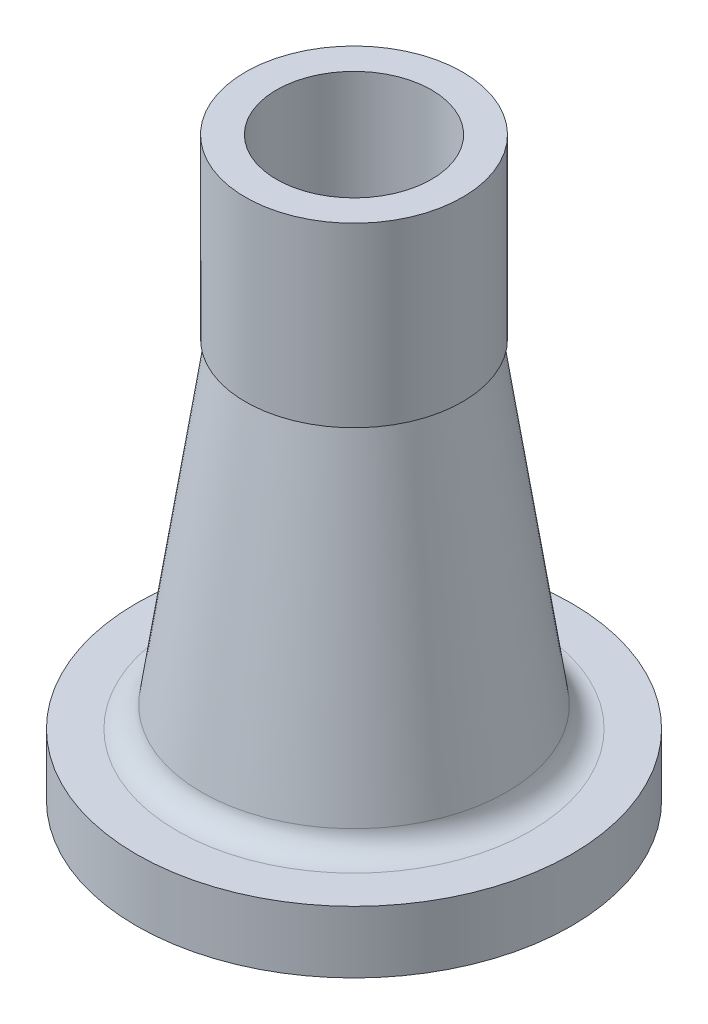
ISO-10303-21;
HEADER;
FILE_DESCRIPTION(('STEP AP214'),'2;1');
FILE_NAME('part.step','',(''),(''),'','','');
FILE_SCHEMA(('AUTOMOTIVE_DESIGN { 1 0 10303 214 1 1 1 1 }'));
ENDSEC;
DATA;
#1=APPLICATION_CONTEXT('core data for automotive mechanical design processes');
#2=APPLICATION_PROTOCOL_DEFINITION('international standard','automotive_design',2000,#1);
#3=PRODUCT_CONTEXT('',#1,'mechanical');
#4=PRODUCT('Part','Part','',(#3));
#5=PRODUCT_RELATED_PRODUCT_CATEGORY('part','',(#4));
#6=PRODUCT_DEFINITION_FORMATION('','',#4);
#7=PRODUCT_DEFINITION_CONTEXT('part definition',#1,'design');
#8=PRODUCT_DEFINITION('design','',#6,#7);
#9=PRODUCT_DEFINITION_SHAPE('','',#8);
#10=(LENGTH_UNIT() NAMED_UNIT(*) SI_UNIT(.MILLI.,.METRE.));
#11=(NAMED_UNIT(*) PLANE_ANGLE_UNIT() SI_UNIT($,.RADIAN.));
#12=(NAMED_UNIT(*) SI_UNIT($,.STERADIAN.) SOLID_ANGLE_UNIT());
#13=UNCERTAINTY_MEASURE_WITH_UNIT(LENGTH_MEASURE(1.E-05),#10,'distance_accuracy_value','');
#14=(GEOMETRIC_REPRESENTATION_CONTEXT(3) GLOBAL_UNCERTAINTY_ASSIGNED_CONTEXT((#13)) GLOBAL_UNIT_ASSIGNED_CONTEXT((#10,
#11,#12)) REPRESENTATION_CONTEXT('',''));
#15=CARTESIAN_POINT('',(0.,0.,0.));
#16=DIRECTION('',(0.,0.,1.));
#17=DIRECTION('',(1.,0.,0.));
#18=AXIS2_PLACEMENT_3D('',#15,#16,#17);
#19=CARTESIAN_POINT('',(35.,128.787624663047,0.));
#20=DIRECTION('',(0.,-1.,0.));
#21=DIRECTION('',(0.,0.,-1.));
#22=AXIS2_PLACEMENT_3D('',#19,#20,#21);
#23=PLANE('',#22);
#24=CARTESIAN_POINT('',(0.,128.787624663047,0.));
#25=DIRECTION('',(0.,-1.,0.));
#26=DIRECTION('',(0.,0.,-1.));
#27=AXIS2_PLACEMENT_3D('',#24,#25,#26);
#28=CIRCLE('',#27,35.);
#29=CARTESIAN_POINT('',(0.,128.787624663047,-35.));
#30=VERTEX_POINT('',#29);
#31=EDGE_CURVE('E80',#30,#30,#28,.T.);
#32=ORIENTED_EDGE('',*,*,#31,.T.);
#33=EDGE_LOOP('',(#32));
#34=FACE_BOUND('',#33,.T.);
#35=CARTESIAN_POINT('',(0.,128.787624663047,0.));
#36=DIRECTION('',(0.,-1.,0.));
#37=DIRECTION('',(0.,0.,-1.));
#38=AXIS2_PLACEMENT_3D('',#35,#36,#37);
#39=CIRCLE('',#38,33.9637624694383);
#40=CARTESIAN_POINT('',(0.,128.787624663047,-33.9637624694383));
#41=VERTEX_POINT('',#40);
#42=EDGE_CURVE('E48',#41,#41,#39,.T.);
#43=ORIENTED_EDGE('',*,*,#42,.F.);
#44=EDGE_LOOP('',(#43));
#45=FACE_BOUND('',#44,.T.);
#46=ADVANCED_FACE('F40',(#34,#45),#23,.T.);
#47=CARTESIAN_POINT('',(0.,20.,0.));
#48=DIRECTION('',(0.,-1.,0.));
#49=DIRECTION('',(0.,0.,-1.));
#50=AXIS2_PLACEMENT_3D('',#47,#48,#49);
#51=CONICAL_SURFACE('',#50,50.1245103142679,0.147474667585903);
#52=CARTESIAN_POINT('',(0.,26.8244745362526,0.));
#53=DIRECTION('',(0.,-1.,0.));
#54=DIRECTION('',(0.,0.,-1.));
#55=AXIS2_PLACEMENT_3D('',#52,#53,#54);
#56=CIRCLE('',#55,49.1107129039886);
#57=CARTESIAN_POINT('',(0.,26.8244745362526,-49.1107129039886));
#58=VERTEX_POINT('',#57);
#59=EDGE_CURVE('E10',#58,#58,#56,.F.);
#60=ORIENTED_EDGE('',*,*,#59,.T.);
#61=EDGE_LOOP('',(#60));
#62=FACE_BOUND('',#61,.T.);
#63=ORIENTED_EDGE('',*,*,#42,.T.);
#64=EDGE_LOOP('',(#63));
#65=FACE_BOUND('',#64,.T.);
#66=ADVANCED_FACE('F97',(#62,#65),#51,.T.);
#67=CARTESIAN_POINT('',(70.1245103142679,20.,0.));
#68=DIRECTION('',(0.,1.,0.));
#69=DIRECTION('',(0.,0.,1.));
#70=AXIS2_PLACEMENT_3D('',#67,#68,#69);
#71=PLANE('',#70);
#72=CARTESIAN_POINT('',(0.,20.,0.));
#73=DIRECTION('',(0.,1.,0.));
#74=DIRECTION('',(0.,0.,1.));
#75=AXIS2_PLACEMENT_3D('',#72,#73,#74);
#76=CIRCLE('',#75,57.0238753491859);
#77=CARTESIAN_POINT('',(0.,20.,57.0238753491859));
#78=VERTEX_POINT('',#77);
#79=EDGE_CURVE('E42',#78,#78,#76,.F.);
#80=ORIENTED_EDGE('',*,*,#79,.T.);
#81=EDGE_LOOP('',(#80));
#82=FACE_BOUND('',#81,.T.);
#83=CARTESIAN_POINT('',(0.,20.,0.));
#84=DIRECTION('',(0.,-1.,0.));
#85=DIRECTION('',(0.,0.,-1.));
#86=AXIS2_PLACEMENT_3D('',#83,#84,#85);
#87=CIRCLE('',#86,70.1245103142679);
#88=CARTESIAN_POINT('',(0.,20.,-70.1245103142679));
#89=VERTEX_POINT('',#88);
#90=EDGE_CURVE('E55',#89,#89,#87,.T.);
#91=ORIENTED_EDGE('',*,*,#90,.F.);
#92=EDGE_LOOP('',(#91));
#93=FACE_BOUND('',#92,.T.);
#94=ADVANCED_FACE('F103',(#82,#93),#71,.T.);
#95=CARTESIAN_POINT('',(0.,0.,0.));
#96=DIRECTION('',(0.,-1.,0.));
#97=DIRECTION('',(0.,0.,-1.));
#98=AXIS2_PLACEMENT_3D('',#95,#96,#97);
#99=CYLINDRICAL_SURFACE('',#98,70.1245103142679);
#100=ORIENTED_EDGE('',*,*,#90,.T.);
#101=EDGE_LOOP('',(#100));
#102=FACE_BOUND('',#101,.T.);
#103=CARTESIAN_POINT('',(0.,0.,0.));
#104=DIRECTION('',(0.,-1.,0.));
#105=DIRECTION('',(0.,0.,-1.));
#106=AXIS2_PLACEMENT_3D('',#103,#104,#105);
#107=CIRCLE('',#106,70.1245103142679);
#108=CARTESIAN_POINT('',(0.,0.,-70.1245103142679));
#109=VERTEX_POINT('',#108);
#110=EDGE_CURVE('E60',#109,#109,#107,.T.);
#111=ORIENTED_EDGE('',*,*,#110,.F.);
#112=EDGE_LOOP('',(#111));
#113=FACE_BOUND('',#112,.T.);
#114=ADVANCED_FACE('F107',(#102,#113),#99,.T.);
#115=CARTESIAN_POINT('',(50.,0.,0.));
#116=DIRECTION('',(0.,-1.,0.));
#117=DIRECTION('',(0.,0.,-1.));
#118=AXIS2_PLACEMENT_3D('',#115,#116,#117);
#119=PLANE('',#118);
#120=ORIENTED_EDGE('',*,*,#110,.T.);
#121=EDGE_LOOP('',(#120));
#122=FACE_BOUND('',#121,.T.);
#123=CARTESIAN_POINT('',(0.,0.,0.));
#124=DIRECTION('',(0.,-1.,0.));
#125=DIRECTION('',(0.,0.,-1.));
#126=AXIS2_PLACEMENT_3D('',#123,#124,#125);
#127=CIRCLE('',#126,50.);
#128=CARTESIAN_POINT('',(0.,0.,-50.));
#129=VERTEX_POINT('',#128);
#130=EDGE_CURVE('E58',#129,#129,#127,.T.);
#131=ORIENTED_EDGE('',*,*,#130,.F.);
#132=EDGE_LOOP('',(#131));
#133=FACE_BOUND('',#132,.T.);
#134=ADVANCED_FACE('F109',(#122,#133),#119,.T.);
#135=CARTESIAN_POINT('',(0.,0.,0.));
#136=DIRECTION('',(0.,-1.,0.));
#137=DIRECTION('',(0.,0.,-1.));
#138=AXIS2_PLACEMENT_3D('',#135,#136,#137);
#139=CYLINDRICAL_SURFACE('',#138,50.);
#140=ORIENTED_EDGE('',*,*,#130,.T.);
#141=EDGE_LOOP('',(#140));
#142=FACE_BOUND('',#141,.T.);
#143=CARTESIAN_POINT('',(0.,3.89945678039064,0.));
#144=DIRECTION('',(0.,-1.,0.));
#145=DIRECTION('',(0.,0.,-1.));
#146=AXIS2_PLACEMENT_3D('',#143,#144,#145);
#147=CIRCLE('',#146,50.);
#148=CARTESIAN_POINT('',(0.,3.89945678039064,-50.));
#149=VERTEX_POINT('',#148);
#150=EDGE_CURVE('E65',#149,#149,#147,.T.);
#151=ORIENTED_EDGE('',*,*,#150,.F.);
#152=EDGE_LOOP('',(#151));
#153=FACE_BOUND('',#152,.T.);
#154=ADVANCED_FACE('F111',(#142,#153),#139,.F.);
#155=CARTESIAN_POINT('',(42.406559130004,3.89945678039064,0.));
#156=DIRECTION('',(0.,-1.,0.));
#157=DIRECTION('',(0.,0.,-1.));
#158=AXIS2_PLACEMENT_3D('',#155,#156,#157);
#159=PLANE('',#158);
#160=ORIENTED_EDGE('',*,*,#150,.T.);
#161=EDGE_LOOP('',(#160));
#162=FACE_BOUND('',#161,.T.);
#163=CARTESIAN_POINT('',(0.,3.89945678039064,0.));
#164=DIRECTION('',(0.,-1.,0.));
#165=DIRECTION('',(0.,0.,-1.));
#166=AXIS2_PLACEMENT_3D('',#163,#164,#165);
#167=CIRCLE('',#166,42.406559130004);
#168=CARTESIAN_POINT('',(0.,3.89945678039064,-42.406559130004));
#169=VERTEX_POINT('',#168);
#170=EDGE_CURVE('E68',#169,#169,#167,.T.);
#171=ORIENTED_EDGE('',*,*,#170,.F.);
#172=EDGE_LOOP('',(#171));
#173=FACE_BOUND('',#172,.T.);
#174=ADVANCED_FACE('F120',(#162,#173),#159,.T.);
#175=CARTESIAN_POINT('',(0.,121.073379639156,0.));
#176=DIRECTION('',(0.,-1.,0.));
#177=DIRECTION('',(0.,0.,-1.));
#178=AXIS2_PLACEMENT_3D('',#175,#176,#177);
#179=CONICAL_SURFACE('',#178,25.,0.147474667585903);
#180=ORIENTED_EDGE('',*,*,#170,.T.);
#181=EDGE_LOOP('',(#180));
#182=FACE_BOUND('',#181,.T.);
#183=CARTESIAN_POINT('',(0.,121.073379639156,0.));
#184=DIRECTION('',(0.,-1.,0.));
#185=DIRECTION('',(0.,0.,-1.));
#186=AXIS2_PLACEMENT_3D('',#183,#184,#185);
#187=CIRCLE('',#186,25.);
#188=CARTESIAN_POINT('',(0.,121.073379639156,-25.));
#189=VERTEX_POINT('',#188);
#190=EDGE_CURVE('E69',#189,#189,#187,.T.);
#191=ORIENTED_EDGE('',*,*,#190,.F.);
#192=EDGE_LOOP('',(#191));
#193=FACE_BOUND('',#192,.T.);
#194=ADVANCED_FACE('F125',(#182,#193),#179,.F.);
#195=CARTESIAN_POINT('',(0.,0.,0.));
#196=DIRECTION('',(0.,-1.,0.));
#197=DIRECTION('',(0.,0.,-1.));
#198=AXIS2_PLACEMENT_3D('',#195,#196,#197);
#199=CYLINDRICAL_SURFACE('',#198,24.9999999999999);
#200=ORIENTED_EDGE('',*,*,#190,.T.);
#201=EDGE_LOOP('',(#200));
#202=FACE_BOUND('',#201,.T.);
#203=CARTESIAN_POINT('',(0.,185.899456780391,0.));
#204=DIRECTION('',(0.,-1.,0.));
#205=DIRECTION('',(0.,0.,-1.));
#206=AXIS2_PLACEMENT_3D('',#203,#204,#205);
#207=CIRCLE('',#206,24.9999999999999);
#208=CARTESIAN_POINT('',(0.,185.899456780391,-24.9999999999999));
#209=VERTEX_POINT('',#208);
#210=EDGE_CURVE('E75',#209,#209,#207,.T.);
#211=ORIENTED_EDGE('',*,*,#210,.F.);
#212=EDGE_LOOP('',(#211));
#213=FACE_BOUND('',#212,.T.);
#214=ADVANCED_FACE('F92',(#202,#213),#199,.F.);
#215=CARTESIAN_POINT('',(24.9999999999999,185.899456780391,0.));
#216=DIRECTION('',(0.,1.,0.));
#217=DIRECTION('',(0.,0.,1.));
#218=AXIS2_PLACEMENT_3D('',#215,#216,#217);
#219=PLANE('',#218);
#220=ORIENTED_EDGE('',*,*,#210,.T.);
#221=EDGE_LOOP('',(#220));
#222=FACE_BOUND('',#221,.T.);
#223=CARTESIAN_POINT('',(0.,185.899456780391,0.));
#224=DIRECTION('',(0.,-1.,0.));
#225=DIRECTION('',(0.,0.,-1.));
#226=AXIS2_PLACEMENT_3D('',#223,#224,#225);
#227=CIRCLE('',#226,34.9999999999999);
#228=CARTESIAN_POINT('',(0.,185.899456780391,-34.9999999999999));
#229=VERTEX_POINT('',#228);
#230=EDGE_CURVE('E73',#229,#229,#227,.T.);
#231=ORIENTED_EDGE('',*,*,#230,.F.);
#232=EDGE_LOOP('',(#231));
#233=FACE_BOUND('',#232,.T.);
#234=ADVANCED_FACE('F88',(#222,#233),#219,.T.);
#235=CARTESIAN_POINT('',(0.,0.,0.));
#236=DIRECTION('',(0.,-1.,0.));
#237=DIRECTION('',(0.,0.,-1.));
#238=AXIS2_PLACEMENT_3D('',#235,#236,#237);
#239=CYLINDRICAL_SURFACE('',#238,35.);
#240=ORIENTED_EDGE('',*,*,#230,.T.);
#241=EDGE_LOOP('',(#240));
#242=FACE_BOUND('',#241,.T.);
#243=ORIENTED_EDGE('',*,*,#31,.F.);
#244=EDGE_LOOP('',(#243));
#245=FACE_BOUND('',#244,.T.);
#246=ADVANCED_FACE('F84',(#242,#245),#239,.T.);
#247=CARTESIAN_POINT('',(0.,28.,0.));
#248=DIRECTION('',(0.,1.,0.));
#249=DIRECTION('',(0.,0.,1.));
#250=AXIS2_PLACEMENT_3D('',#247,#248,#249);
#251=TOROIDAL_SURFACE('',#250,57.0238753491859,8.);
#252=ORIENTED_EDGE('',*,*,#59,.F.);
#253=EDGE_LOOP('',(#252));
#254=FACE_BOUND('',#253,.T.);
#255=ORIENTED_EDGE('',*,*,#79,.F.);
#256=EDGE_LOOP('',(#255));
#257=FACE_BOUND('',#256,.T.);
#258=ADVANCED_FACE('F39',(#254,#257),#251,.F.);
#259=CLOSED_SHELL('',(#46,#66,#94,#114,#134,#154,#174,#194,#214,#234,#246,#258));
#260=MANIFOLD_SOLID_BREP('B2',#259);
#261=ADVANCED_BREP_SHAPE_REPRESENTATION('',(#18,#260),#14);
#262=SHAPE_DEFINITION_REPRESENTATION(#9,#261);
ENDSEC;
END-ISO-10303-21;
